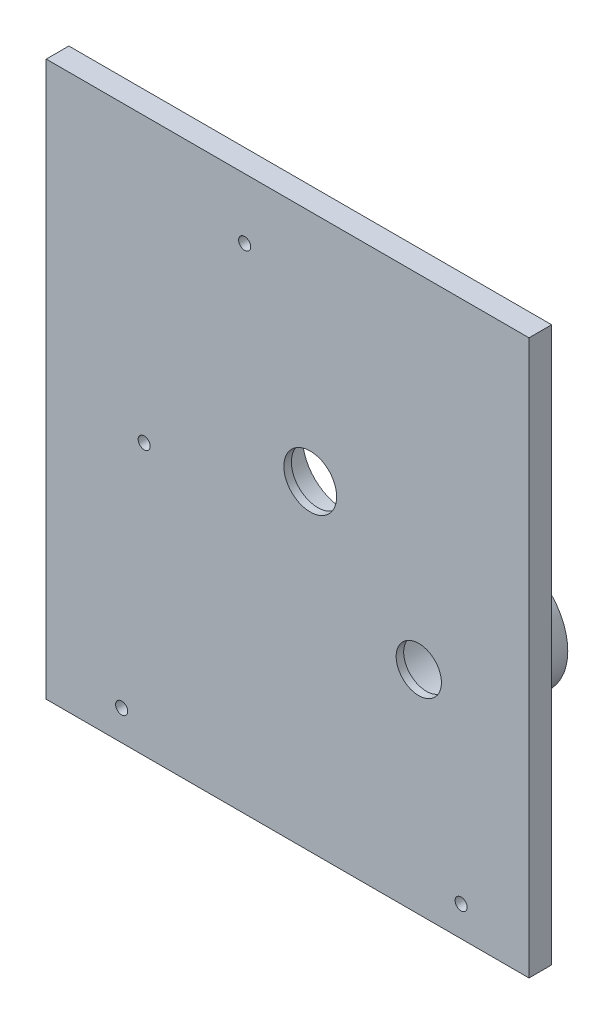
ISO-10303-21;
HEADER;
FILE_DESCRIPTION(('STEP AP214'),'2;1');
FILE_NAME('part.step','',(''),(''),'','','');
FILE_SCHEMA(('AUTOMOTIVE_DESIGN { 1 0 10303 214 1 1 1 1 }'));
ENDSEC;
DATA;
#1=APPLICATION_CONTEXT('core data for automotive mechanical design processes');
#2=APPLICATION_PROTOCOL_DEFINITION('international standard','automotive_design',2000,#1);
#3=PRODUCT_CONTEXT('',#1,'mechanical');
#4=PRODUCT('Part','Part','',(#3));
#5=PRODUCT_RELATED_PRODUCT_CATEGORY('part','',(#4));
#6=PRODUCT_DEFINITION_FORMATION('','',#4);
#7=PRODUCT_DEFINITION_CONTEXT('part definition',#1,'design');
#8=PRODUCT_DEFINITION('design','',#6,#7);
#9=PRODUCT_DEFINITION_SHAPE('','',#8);
#10=(LENGTH_UNIT() NAMED_UNIT(*) SI_UNIT(.MILLI.,.METRE.));
#11=(NAMED_UNIT(*) PLANE_ANGLE_UNIT() SI_UNIT($,.RADIAN.));
#12=(NAMED_UNIT(*) SI_UNIT($,.STERADIAN.) SOLID_ANGLE_UNIT());
#13=UNCERTAINTY_MEASURE_WITH_UNIT(LENGTH_MEASURE(1.E-05),#10,'distance_accuracy_value','');
#14=(GEOMETRIC_REPRESENTATION_CONTEXT(3) GLOBAL_UNCERTAINTY_ASSIGNED_CONTEXT((#13)) GLOBAL_UNIT_ASSIGNED_CONTEXT((#10,
#11,#12)) REPRESENTATION_CONTEXT('',''));
#15=CARTESIAN_POINT('',(0.,0.,0.));
#16=DIRECTION('',(0.,0.,1.));
#17=DIRECTION('',(1.,0.,0.));
#18=AXIS2_PLACEMENT_3D('',#15,#16,#17);
#19=CARTESIAN_POINT('',(28.779245994292,-28.77924599429,-2.));
#20=DIRECTION('',(0.,0.,-1.));
#21=DIRECTION('',(1.,0.,0.));
#22=AXIS2_PLACEMENT_3D('',#19,#20,#21);
#23=CYLINDRICAL_SURFACE('',#22,12.7);
#24=CARTESIAN_POINT('',(37.759502115362,-37.75950211536,-13.7));
#25=CARTESIAN_POINT('',(37.650461904877,-37.86854232584,-13.7));
#26=CARTESIAN_POINT('',(37.541928685919,-37.97404920758,-13.72090495198));
#27=CARTESIAN_POINT('',(37.436312459329,-38.07380946713,-13.76136007281));
#28=CARTESIAN_POINT('',(37.335942627703,-38.16603991759,-13.81944378148));
#29=CARTESIAN_POINT('',(37.242962604331,-38.24940811271,-13.89269380523));
#30=CARTESIAN_POINT('',(37.15915747597,-38.32302706371,-13.97813572432));
#31=CARTESIAN_POINT('',(37.085755111253,-38.38646516662,-14.07231691033));
#32=CARTESIAN_POINT('',(36.965496911283,-38.48908937768,-14.26282459649));
#33=CARTESIAN_POINT('',(36.916053432271,-38.53060100708,-14.36000680346));
#34=CARTESIAN_POINT('',(36.874944151934,-38.56467575526,-14.46151845749));
#35=CARTESIAN_POINT('',(36.842143643054,-38.59160768538,-14.56624065154));
#36=CARTESIAN_POINT('',(36.817600334645,-38.61163420971,-14.67323394699));
#37=CARTESIAN_POINT('',(36.801261306486,-38.62492428934,-14.78168081212));
#38=CARTESIAN_POINT('',(36.793091752401,-38.63156938348,-14.89083952936));
#39=CARTESIAN_POINT('',(36.793091752401,-38.63156938348,-15.13667288948));
#40=CARTESIAN_POINT('',(36.805898042618,-38.62115270491,-15.27338382111));
#41=CARTESIAN_POINT('',(36.831525244994,-38.60030797097,-15.40875066075));
#42=CARTESIAN_POINT('',(36.870075574505,-38.56879582985,-15.54127785331));
#43=CARTESIAN_POINT('',(36.921670105704,-38.52620885157,-15.66922981452));
#44=CARTESIAN_POINT('',(36.986372174624,-38.47200299956,-15.79050613742));
#45=CARTESIAN_POINT('',(37.064086917888,-38.40555634566,-15.90246825689));
#46=CARTESIAN_POINT('',(37.235241327505,-38.25541091671,-16.09041889586));
#47=CARTESIAN_POINT('',(37.328087822277,-38.17257684106,-16.17106842845));
#48=CARTESIAN_POINT('',(37.431150511909,-38.07863871632,-16.2376790855));
#49=CARTESIAN_POINT('',(37.54150431182,-37.97535894599,-16.28581701522));
#50=CARTESIAN_POINT('',(37.655600530426,-37.8652988694,-16.31257087018));
#51=CARTESIAN_POINT('',(37.769763151242,-37.75166648716,-16.31658847496));
#52=CARTESIAN_POINT('',(37.880594793349,-37.63805555986,-16.29813262518));
#53=CARTESIAN_POINT('',(38.151791805837,-37.35268574142,-16.19708559974));
#54=CARTESIAN_POINT('',(38.294364624152,-37.19502166044,-16.08603312995));
#55=CARTESIAN_POINT('',(38.410525668228,-37.06075688414,-15.94042873309));
#56=CARTESIAN_POINT('',(38.501092318106,-36.95271921861,-15.77079385383));
#57=CARTESIAN_POINT('',(38.567244882751,-36.87217027874,-15.58565655945));
#58=CARTESIAN_POINT('',(38.610355376195,-36.8191731119,-15.39186827387));
#59=CARTESIAN_POINT('',(38.631569383486,-36.7930917524,-15.19504226489));
#60=CARTESIAN_POINT('',(38.631569383486,-36.7930917524,-14.8908409672));
#61=CARTESIAN_POINT('',(38.624924468209,-36.80126108556,-14.78168301919));
#62=CARTESIAN_POINT('',(38.611634587314,-36.81759987215,-14.67323593319));
#63=CARTESIAN_POINT('',(38.591608069323,-36.84214317479,-14.56624152804));
#64=CARTESIAN_POINT('',(38.564675804202,-36.87494410242,-14.46151779753));
#65=CARTESIAN_POINT('',(38.530600436905,-36.91605413325,-14.36000494022));
#66=CARTESIAN_POINT('',(38.48908838179,-36.9654980783,-14.26282274775));
#67=CARTESIAN_POINT('',(38.386482332008,-37.08573499632,-14.0723487755));
#68=CARTESIAN_POINT('',(38.323046594774,-37.15913518972,-13.97815678669));
#69=CARTESIAN_POINT('',(38.249414956983,-37.24295565862,-13.89269009212));
#70=CARTESIAN_POINT('',(38.16602412237,-37.33596133853,-13.81942065777));
#71=CARTESIAN_POINT('',(38.073770005835,-37.43635588697,-13.76133272722));
#72=CARTESIAN_POINT('',(37.973996713014,-37.54198353375,-13.7208886858));
#73=CARTESIAN_POINT('',(37.868499899157,-37.65050433156,-13.7));
#74=CARTESIAN_POINT('',(37.759502115362,-37.75950211536,-13.7));
#75=B_SPLINE_CURVE_WITH_KNOTS('',8,(#24,#25,#26,#27,#28,#29,#30,#31,#32,#33,#34,#35,#36,#37,#38,
#39,#40,#41,#42,#43,#44,#45,#46,#47,#48,#49,#50,#51,#52,#53,#54,#55,#56,#57,#58,#59,#60,#61,#62,
#63,#64,#65,#66,#67,#68,#69,#70,#71,#72,#73,#74),.UNSPECIFIED.,.T.,.F.,(9,7,7,7,7,7,7,9),(0.,
0.130152523031,0.250374427446,0.40089663535,0.535566384316,0.750047286717,0.870085514694,1.),.UNSPECIFIED.);
#76=CARTESIAN_POINT('',(37.759502115362,-37.75950211536,-13.7));
#77=VERTEX_POINT('',#76);
#78=EDGE_CURVE('E189',#77,#77,#75,.T.);
#79=ORIENTED_EDGE('',*,*,#78,.T.);
#80=EDGE_LOOP('',(#79));
#81=FACE_BOUND('',#80,.T.);
#82=CARTESIAN_POINT('',(28.779245994292,-28.77924599429,-2.));
#83=DIRECTION('',(0.,0.,-1.));
#84=DIRECTION('',(1.,0.,0.));
#85=AXIS2_PLACEMENT_3D('',#82,#83,#84);
#86=CIRCLE('',#85,12.7);
#87=CARTESIAN_POINT('',(41.479245994292,-28.77924599429,-2.));
#88=VERTEX_POINT('',#87);
#89=EDGE_CURVE('E166',#88,#88,#86,.T.);
#90=ORIENTED_EDGE('',*,*,#89,.F.);
#91=DIRECTION('',(0.,0.,-1.));
#92=VECTOR('',#91,1.);
#93=CARTESIAN_POINT('',(41.479245994292,-28.77924599429,-2.));
#94=LINE('',#93,#92);
#95=CARTESIAN_POINT('',(41.479245994292,-28.77924599429,-24.));
#96=VERTEX_POINT('',#95);
#97=EDGE_CURVE('E9',#88,#96,#94,.T.);
#98=ORIENTED_EDGE('',*,*,#97,.T.);
#99=CARTESIAN_POINT('',(28.779245994292,-28.77924599429,-24.));
#100=DIRECTION('',(0.,0.,-1.));
#101=DIRECTION('',(1.,0.,0.));
#102=AXIS2_PLACEMENT_3D('',#99,#100,#101);
#103=CIRCLE('',#102,12.7);
#104=EDGE_CURVE('E190',#96,#96,#103,.T.);
#105=ORIENTED_EDGE('',*,*,#104,.T.);
#106=ORIENTED_EDGE('',*,*,#97,.F.);
#107=EDGE_LOOP('',(#90,#98,#105,#106));
#108=FACE_BOUND('',#107,.T.);
#109=ADVANCED_FACE('F15',(#81,#108),#23,.F.);
#110=CARTESIAN_POINT('',(0.,0.,-2.));
#111=DIRECTION('',(0.,0.,-1.));
#112=DIRECTION('',(1.,0.,0.));
#113=AXIS2_PLACEMENT_3D('',#110,#111,#112);
#114=CYLINDRICAL_SURFACE('',#113,11.05);
#115=DIRECTION('',(0.,0.,-1.));
#116=VECTOR('',#115,1.);
#117=CARTESIAN_POINT('',(11.05,0.,-2.));
#118=LINE('',#117,#116);
#119=CARTESIAN_POINT('',(11.05,0.,-2.));
#120=VERTEX_POINT('',#119);
#121=CARTESIAN_POINT('',(11.05,0.,-9.));
#122=VERTEX_POINT('',#121);
#123=EDGE_CURVE('E28',#120,#122,#118,.T.);
#124=ORIENTED_EDGE('',*,*,#123,.F.);
#125=CARTESIAN_POINT('',(0.,0.,-2.));
#126=DIRECTION('',(0.,0.,-1.));
#127=DIRECTION('',(1.,0.,0.));
#128=AXIS2_PLACEMENT_3D('',#125,#126,#127);
#129=CIRCLE('',#128,11.05);
#130=EDGE_CURVE('E204',#120,#120,#129,.T.);
#131=ORIENTED_EDGE('',*,*,#130,.F.);
#132=ORIENTED_EDGE('',*,*,#123,.T.);
#133=CARTESIAN_POINT('',(0.,0.,-9.));
#134=DIRECTION('',(0.,0.,-1.));
#135=DIRECTION('',(1.,0.,0.));
#136=AXIS2_PLACEMENT_3D('',#133,#134,#135);
#137=CIRCLE('',#136,11.05);
#138=EDGE_CURVE('E263',#122,#122,#137,.T.);
#139=ORIENTED_EDGE('',*,*,#138,.T.);
#140=EDGE_LOOP('',(#124,#131,#132,#139));
#141=FACE_BOUND('',#140,.T.);
#142=ADVANCED_FACE('F281',(#141),#114,.F.);
#143=CARTESIAN_POINT('',(28.779245994292,-28.77924599429,-2.));
#144=DIRECTION('',(0.,0.,-1.));
#145=DIRECTION('',(0.,-1.,0.));
#146=AXIS2_PLACEMENT_3D('',#143,#144,#145);
#147=PLANE('',#146);
#148=CARTESIAN_POINT('',(28.779245994292,-28.77924599429,-2.));
#149=DIRECTION('',(0.,0.,-1.));
#150=DIRECTION('',(1.,0.,0.));
#151=AXIS2_PLACEMENT_3D('',#148,#149,#150);
#152=CIRCLE('',#151,6.);
#153=CARTESIAN_POINT('',(34.779245994292,-28.77924599429,-2.));
#154=VERTEX_POINT('',#153);
#155=EDGE_CURVE('E251',#154,#154,#152,.T.);
#156=ORIENTED_EDGE('',*,*,#155,.F.);
#157=EDGE_LOOP('',(#156));
#158=FACE_BOUND('',#157,.T.);
#159=ORIENTED_EDGE('',*,*,#89,.T.);
#160=EDGE_LOOP('',(#159));
#161=FACE_BOUND('',#160,.T.);
#162=ADVANCED_FACE('F277',(#158,#161),#147,.T.);
#163=CARTESIAN_POINT('',(0.,0.,-2.));
#164=DIRECTION('',(0.,0.,-1.));
#165=DIRECTION('',(0.,-1.,0.));
#166=AXIS2_PLACEMENT_3D('',#163,#164,#165);
#167=PLANE('',#166);
#168=CARTESIAN_POINT('',(0.,0.,-2.));
#169=DIRECTION('',(0.,0.,-1.));
#170=DIRECTION('',(1.,0.,0.));
#171=AXIS2_PLACEMENT_3D('',#168,#169,#170);
#172=CIRCLE('',#171,7.);
#173=CARTESIAN_POINT('',(7.,0.,-2.));
#174=VERTEX_POINT('',#173);
#175=EDGE_CURVE('E235',#174,#174,#172,.T.);
#176=ORIENTED_EDGE('',*,*,#175,.F.);
#177=EDGE_LOOP('',(#176));
#178=FACE_BOUND('',#177,.T.);
#179=ORIENTED_EDGE('',*,*,#130,.T.);
#180=EDGE_LOOP('',(#179));
#181=FACE_BOUND('',#180,.T.);
#182=ADVANCED_FACE('F280',(#178,#181),#167,.T.);
#183=CARTESIAN_POINT('',(35.143207024971,-35.14320702497,-15.));
#184=DIRECTION('',(0.707106781186548,-0.707106781186548,0.));
#185=DIRECTION('',(0.,0.,1.));
#186=AXIS2_PLACEMENT_3D('',#183,#184,#185);
#187=CYLINDRICAL_SURFACE('',#186,1.3);
#188=DIRECTION('',(0.707106781186548,-0.707106781186548,0.));
#189=VECTOR('',#188,1.);
#190=CARTESIAN_POINT('',(35.143207024971,-35.14320702497,-13.7));
#191=LINE('',#190,#189);
#192=CARTESIAN_POINT('',(39.739401102684,-39.73940110268,-13.7));
#193=VERTEX_POINT('',#192);
#194=EDGE_CURVE('E185',#77,#193,#191,.T.);
#195=ORIENTED_EDGE('',*,*,#194,.F.);
#196=ORIENTED_EDGE('',*,*,#78,.F.);
#197=ORIENTED_EDGE('',*,*,#194,.T.);
#198=CARTESIAN_POINT('',(39.739401102684,-39.73940110268,-13.7));
#199=CARTESIAN_POINT('',(39.625943221093,-39.85285898427,-13.7));
#200=CARTESIAN_POINT('',(39.513457153856,-39.96266042467,-13.72263313503));
#201=CARTESIAN_POINT('',(39.404586714331,-40.06635362367,-13.76628467336));
#202=CARTESIAN_POINT('',(39.301824795817,-40.16196654389,-13.82874292293));
#203=CARTESIAN_POINT('',(39.207409698811,-40.2480201824,-13.9072260165));
#204=CARTESIAN_POINT('',(39.123149894221,-40.32352857562,-13.99841561521));
#205=CARTESIAN_POINT('',(39.050219376437,-40.38802428058,-14.0984989763));
#206=CARTESIAN_POINT('',(38.936809711379,-40.48730750636,-14.29238908591));
#207=CARTESIAN_POINT('',(38.892227658128,-40.52586540643,-14.38644473771));
#208=CARTESIAN_POINT('',(38.855200591353,-40.55758553642,-14.48423376382));
#209=CARTESIAN_POINT('',(38.825677175152,-40.58269991262,-14.58480059896));
#210=CARTESIAN_POINT('',(38.80359432467,-40.60139768473,-14.68733850356));
#211=CARTESIAN_POINT('',(38.788895330839,-40.61381461563,-14.79114345518));
#212=CARTESIAN_POINT('',(38.781545531931,-40.62002316301,-14.89557156225));
#213=CARTESIAN_POINT('',(38.781545531931,-40.62002316301,-15.13662814283));
#214=CARTESIAN_POINT('',(38.794126038121,-40.60939591523,-15.27329765444));
#215=CARTESIAN_POINT('',(38.81930248709,-40.58812882513,-15.40863499432));
#216=CARTESIAN_POINT('',(38.857194373328,-40.55599154932,-15.54115096834));
#217=CARTESIAN_POINT('',(38.907956225339,-40.51259771868,-15.66911276496));
#218=CARTESIAN_POINT('',(38.971703206897,-40.45744115554,-15.79041847662));
#219=CARTESIAN_POINT('',(39.048412586111,-40.38995873762,-15.90242337583));
#220=CARTESIAN_POINT('',(39.217714734278,-40.2378635383,-16.09043105456));
#221=CARTESIAN_POINT('',(39.309658118117,-40.15411982757,-16.17107831196));
#222=CARTESIAN_POINT('',(39.411895557439,-40.05935649378,-16.23768580474));
#223=CARTESIAN_POINT('',(39.521611002259,-39.95543727781,-16.28582218233));
#224=CARTESIAN_POINT('',(39.635344179846,-39.84501148071,-16.31257366086));
#225=CARTESIAN_POINT('',(39.749458000337,-39.73133132282,-16.31658713835));
#226=CARTESIAN_POINT('',(39.860535344799,-39.61797627224,-16.29812902331));
#227=CARTESIAN_POINT('',(40.133067278953,-39.33383070942,-16.197061906));
#228=CARTESIAN_POINT('',(40.277041492998,-39.17748769457,-16.08595168759));
#229=CARTESIAN_POINT('',(40.394848720578,-39.0448488947,-15.94028268267));
#230=CARTESIAN_POINT('',(40.486985233856,-38.93841310303,-15.77059836585));
#231=CARTESIAN_POINT('',(40.554416232005,-38.85920914176,-15.58544333492));
#232=CARTESIAN_POINT('',(40.598391708589,-38.80715343228,-15.39168024994));
#233=CARTESIAN_POINT('',(40.620023163016,-38.78154553193,-15.19492671048));
#234=CARTESIAN_POINT('',(40.620023163016,-38.78154553193,-14.89557259311));
#235=CARTESIAN_POINT('',(40.613814733481,-38.78889520252,-14.79114506668));
#236=CARTESIAN_POINT('',(40.601397947834,-38.80359401161,-14.68733993968));
#237=CARTESIAN_POINT('',(40.582700187262,-38.8256768436,-14.58480115804));
#238=CARTESIAN_POINT('',(40.557585546986,-38.8552005849,-14.4842331007));
#239=CARTESIAN_POINT('',(40.525864904427,-38.89222825601,-14.38644309083));
#240=CARTESIAN_POINT('',(40.487306649276,-38.93681069041,-14.29238741212));
#241=CARTESIAN_POINT('',(40.388043105908,-39.05019787256,-14.09853574027));
#242=CARTESIAN_POINT('',(40.323550514466,-39.12312535319,-13.99844027524));
#243=CARTESIAN_POINT('',(40.248028348729,-39.20740134178,-13.90722221459));
#244=CARTESIAN_POINT('',(40.161949444393,-39.30184457998,-13.82871653783));
#245=CARTESIAN_POINT('',(40.066309842044,-39.40463424572,-13.76625311167));
#246=CARTESIAN_POINT('',(39.962601828139,-39.51351799373,-13.72261421457));
#247=CARTESIAN_POINT('',(39.852811543501,-39.62599066186,-13.7));
#248=CARTESIAN_POINT('',(39.739401102684,-39.73940110268,-13.7));
#249=B_SPLINE_CURVE_WITH_KNOTS('',8,(#198,#199,#200,#201,#202,#203,#204,#205,#206,#207,#208,
#209,#210,#211,#212,#213,#214,#215,#216,#217,#218,#219,#220,#221,#222,#223,#224,#225,#226,#227,
#228,#229,#230,#231,#232,#233,#234,#235,#236,#237,#238,#239,#240,#241,#242,#243,#244,#245,#246,
#247,#248),.UNSPECIFIED.,.T.,.F.,(9,7,7,7,7,7,7,9),(0.,0.135160186932,0.250245984695,
0.400817602485,0.535489082991,0.750074444956,0.865033512641,1.),.UNSPECIFIED.);
#250=EDGE_CURVE('E19',#193,#193,#249,.T.);
#251=ORIENTED_EDGE('',*,*,#250,.T.);
#252=EDGE_LOOP('',(#195,#196,#197,#251));
#253=FACE_BOUND('',#252,.T.);
#254=ADVANCED_FACE('F427',(#253),#187,.F.);
#255=CARTESIAN_POINT('',(28.779245994292,-28.77924599429,-24.));
#256=DIRECTION('',(0.,0.,-1.));
#257=DIRECTION('',(0.,-1.,0.));
#258=AXIS2_PLACEMENT_3D('',#255,#256,#257);
#259=PLANE('',#258);
#260=ORIENTED_EDGE('',*,*,#104,.F.);
#261=EDGE_LOOP('',(#260));
#262=FACE_BOUND('',#261,.T.);
#263=CARTESIAN_POINT('',(28.779245994292,-28.77924599429,-24.));
#264=DIRECTION('',(0.,0.,-1.));
#265=DIRECTION('',(1.,0.,0.));
#266=AXIS2_PLACEMENT_3D('',#263,#264,#265);
#267=CIRCLE('',#266,15.5);
#268=CARTESIAN_POINT('',(44.279245994292,-28.77924599429,-24.));
#269=VERTEX_POINT('',#268);
#270=EDGE_CURVE('E330',#269,#269,#267,.T.);
#271=ORIENTED_EDGE('',*,*,#270,.T.);
#272=EDGE_LOOP('',(#271));
#273=FACE_BOUND('',#272,.T.);
#274=ADVANCED_FACE('F485',(#262,#273),#259,.T.);
#275=CARTESIAN_POINT('',(0.,0.,-9.));
#276=DIRECTION('',(0.,0.,-1.));
#277=DIRECTION('',(0.,-1.,0.));
#278=AXIS2_PLACEMENT_3D('',#275,#276,#277);
#279=PLANE('',#278);
#280=ORIENTED_EDGE('',*,*,#138,.F.);
#281=EDGE_LOOP('',(#280));
#282=FACE_BOUND('',#281,.T.);
#283=CARTESIAN_POINT('',(0.,0.,-9.));
#284=DIRECTION('',(0.,0.,-1.));
#285=DIRECTION('',(1.,0.,0.));
#286=AXIS2_PLACEMENT_3D('',#283,#284,#285);
#287=CIRCLE('',#286,15.);
#288=CARTESIAN_POINT('',(15.,0.,-9.));
#289=VERTEX_POINT('',#288);
#290=EDGE_CURVE('E162',#289,#289,#287,.T.);
#291=ORIENTED_EDGE('',*,*,#290,.T.);
#292=EDGE_LOOP('',(#291));
#293=FACE_BOUND('',#292,.T.);
#294=ADVANCED_FACE('F398',(#282,#293),#279,.T.);
#295=CARTESIAN_POINT('',(28.779245994292,-28.77924599429,5.));
#296=DIRECTION('',(0.,0.,-1.));
#297=DIRECTION('',(1.,0.,0.));
#298=AXIS2_PLACEMENT_3D('',#295,#296,#297);
#299=CYLINDRICAL_SURFACE('',#298,6.);
#300=DIRECTION('',(0.,0.,-1.));
#301=VECTOR('',#300,1.);
#302=CARTESIAN_POINT('',(34.779245994292,-28.77924599429,5.));
#303=LINE('',#302,#301);
#304=CARTESIAN_POINT('',(34.779245994292,-28.77924599429,0.));
#305=VERTEX_POINT('',#304);
#306=EDGE_CURVE('E241',#305,#154,#303,.T.);
#307=ORIENTED_EDGE('',*,*,#306,.F.);
#308=CARTESIAN_POINT('',(28.779245994292,-28.77924599429,0.));
#309=DIRECTION('',(0.,0.,-1.));
#310=DIRECTION('',(1.,0.,0.));
#311=AXIS2_PLACEMENT_3D('',#308,#309,#310);
#312=CIRCLE('',#311,6.);
#313=EDGE_CURVE('E184',#305,#305,#312,.T.);
#314=ORIENTED_EDGE('',*,*,#313,.F.);
#315=ORIENTED_EDGE('',*,*,#306,.T.);
#316=ORIENTED_EDGE('',*,*,#155,.T.);
#317=EDGE_LOOP('',(#307,#314,#315,#316));
#318=FACE_BOUND('',#317,.T.);
#319=ADVANCED_FACE('F274',(#318),#299,.F.);
#320=CARTESIAN_POINT('',(0.,0.,5.));
#321=DIRECTION('',(0.,0.,-1.));
#322=DIRECTION('',(1.,0.,0.));
#323=AXIS2_PLACEMENT_3D('',#320,#321,#322);
#324=CYLINDRICAL_SURFACE('',#323,7.);
#325=DIRECTION('',(0.,0.,-1.));
#326=VECTOR('',#325,1.);
#327=CARTESIAN_POINT('',(7.,0.,5.));
#328=LINE('',#327,#326);
#329=CARTESIAN_POINT('',(7.,0.,0.));
#330=VERTEX_POINT('',#329);
#331=EDGE_CURVE('E231',#330,#174,#328,.T.);
#332=ORIENTED_EDGE('',*,*,#331,.F.);
#333=CARTESIAN_POINT('',(0.,0.,0.));
#334=DIRECTION('',(0.,0.,-1.));
#335=DIRECTION('',(1.,0.,0.));
#336=AXIS2_PLACEMENT_3D('',#333,#334,#335);
#337=CIRCLE('',#336,7.);
#338=EDGE_CURVE('E179',#330,#330,#337,.T.);
#339=ORIENTED_EDGE('',*,*,#338,.F.);
#340=ORIENTED_EDGE('',*,*,#331,.T.);
#341=ORIENTED_EDGE('',*,*,#175,.T.);
#342=EDGE_LOOP('',(#332,#339,#340,#341));
#343=FACE_BOUND('',#342,.T.);
#344=ADVANCED_FACE('F397',(#343),#324,.F.);
#345=CARTESIAN_POINT('',(40.,-77.,20.));
#346=DIRECTION('',(0.,0.,-1.));
#347=DIRECTION('',(1.,0.,0.));
#348=AXIS2_PLACEMENT_3D('',#345,#346,#347);
#349=CYLINDRICAL_SURFACE('',#348,1.6);
#350=DIRECTION('',(0.,0.,-1.));
#351=VECTOR('',#350,1.);
#352=CARTESIAN_POINT('',(41.6,-77.,20.));
#353=LINE('',#352,#351);
#354=CARTESIAN_POINT('',(41.6,-77.,0.));
#355=VERTEX_POINT('',#354);
#356=CARTESIAN_POINT('',(41.6,-77.,-6.));
#357=VERTEX_POINT('',#356);
#358=EDGE_CURVE('E228',#355,#357,#353,.T.);
#359=ORIENTED_EDGE('',*,*,#358,.F.);
#360=CARTESIAN_POINT('',(40.,-77.,0.));
#361=DIRECTION('',(0.,0.,-1.));
#362=DIRECTION('',(1.,0.,0.));
#363=AXIS2_PLACEMENT_3D('',#360,#361,#362);
#364=CIRCLE('',#363,1.6);
#365=EDGE_CURVE('E262',#355,#355,#364,.T.);
#366=ORIENTED_EDGE('',*,*,#365,.F.);
#367=ORIENTED_EDGE('',*,*,#358,.T.);
#368=CARTESIAN_POINT('',(40.,-77.,-6.));
#369=DIRECTION('',(0.,0.,-1.));
#370=DIRECTION('',(1.,0.,0.));
#371=AXIS2_PLACEMENT_3D('',#368,#369,#370);
#372=CIRCLE('',#371,1.6);
#373=EDGE_CURVE('E145',#357,#357,#372,.T.);
#374=ORIENTED_EDGE('',*,*,#373,.T.);
#375=EDGE_LOOP('',(#359,#366,#367,#374));
#376=FACE_BOUND('',#375,.T.);
#377=ADVANCED_FACE('F17',(#376),#349,.F.);
#378=CARTESIAN_POINT('',(28.779245994292,-28.77924599429,-6.));
#379=DIRECTION('',(0.,0.,-1.));
#380=DIRECTION('',(1.,0.,0.));
#381=AXIS2_PLACEMENT_3D('',#378,#379,#380);
#382=CYLINDRICAL_SURFACE('',#381,15.5);
#383=ORIENTED_EDGE('',*,*,#250,.F.);
#384=EDGE_LOOP('',(#383));
#385=FACE_BOUND('',#384,.T.);
#386=DIRECTION('',(0.,0.,-1.));
#387=VECTOR('',#386,1.);
#388=CARTESIAN_POINT('',(44.279245994292,-28.77924599429,-6.));
#389=LINE('',#388,#387);
#390=CARTESIAN_POINT('',(44.279245994292,-28.77924599429,-6.));
#391=VERTEX_POINT('',#390);
#392=EDGE_CURVE('E174',#391,#269,#389,.T.);
#393=ORIENTED_EDGE('',*,*,#392,.T.);
#394=ORIENTED_EDGE('',*,*,#270,.F.);
#395=ORIENTED_EDGE('',*,*,#392,.F.);
#396=CARTESIAN_POINT('',(28.779245994292,-28.77924599429,-6.));
#397=DIRECTION('',(0.,0.,-1.));
#398=DIRECTION('',(1.,0.,0.));
#399=AXIS2_PLACEMENT_3D('',#396,#397,#398);
#400=CIRCLE('',#399,15.5);
#401=EDGE_CURVE('E152',#391,#391,#400,.T.);
#402=ORIENTED_EDGE('',*,*,#401,.T.);
#403=EDGE_LOOP('',(#393,#394,#395,#402));
#404=FACE_BOUND('',#403,.T.);
#405=ADVANCED_FACE('F400',(#385,#404),#382,.T.);
#406=CARTESIAN_POINT('',(-50.,-77.,20.));
#407=DIRECTION('',(0.,0.,-1.));
#408=DIRECTION('',(1.,0.,0.));
#409=AXIS2_PLACEMENT_3D('',#406,#407,#408);
#410=CYLINDRICAL_SURFACE('',#409,1.6);
#411=DIRECTION('',(0.,0.,-1.));
#412=VECTOR('',#411,1.);
#413=CARTESIAN_POINT('',(-48.4,-77.,20.));
#414=LINE('',#413,#412);
#415=CARTESIAN_POINT('',(-48.4,-77.,0.));
#416=VERTEX_POINT('',#415);
#417=CARTESIAN_POINT('',(-48.4,-77.,-6.));
#418=VERTEX_POINT('',#417);
#419=EDGE_CURVE('E161',#416,#418,#414,.T.);
#420=ORIENTED_EDGE('',*,*,#419,.F.);
#421=CARTESIAN_POINT('',(-50.,-77.,0.));
#422=DIRECTION('',(0.,0.,-1.));
#423=DIRECTION('',(1.,0.,0.));
#424=AXIS2_PLACEMENT_3D('',#421,#422,#423);
#425=CIRCLE('',#424,1.6);
#426=EDGE_CURVE('E180',#416,#416,#425,.T.);
#427=ORIENTED_EDGE('',*,*,#426,.F.);
#428=ORIENTED_EDGE('',*,*,#419,.T.);
#429=CARTESIAN_POINT('',(-50.,-77.,-6.));
#430=DIRECTION('',(0.,0.,-1.));
#431=DIRECTION('',(1.,0.,0.));
#432=AXIS2_PLACEMENT_3D('',#429,#430,#431);
#433=CIRCLE('',#432,1.6);
#434=EDGE_CURVE('E195',#418,#418,#433,.T.);
#435=ORIENTED_EDGE('',*,*,#434,.T.);
#436=EDGE_LOOP('',(#420,#427,#428,#435));
#437=FACE_BOUND('',#436,.T.);
#438=ADVANCED_FACE('F393',(#437),#410,.F.);
#439=CARTESIAN_POINT('',(0.,0.,-6.));
#440=DIRECTION('',(0.,0.,-1.));
#441=DIRECTION('',(1.,0.,0.));
#442=AXIS2_PLACEMENT_3D('',#439,#440,#441);
#443=CYLINDRICAL_SURFACE('',#442,15.);
#444=ORIENTED_EDGE('',*,*,#290,.F.);
#445=DIRECTION('',(0.,0.,-1.));
#446=VECTOR('',#445,1.);
#447=CARTESIAN_POINT('',(15.,0.,-6.));
#448=LINE('',#447,#446);
#449=CARTESIAN_POINT('',(15.,0.,-6.));
#450=VERTEX_POINT('',#449);
#451=EDGE_CURVE('E158',#450,#289,#448,.T.);
#452=ORIENTED_EDGE('',*,*,#451,.F.);
#453=CARTESIAN_POINT('',(0.,0.,-6.));
#454=DIRECTION('',(0.,0.,-1.));
#455=DIRECTION('',(1.,0.,0.));
#456=AXIS2_PLACEMENT_3D('',#453,#454,#455);
#457=CIRCLE('',#456,15.);
#458=EDGE_CURVE('E191',#450,#450,#457,.T.);
#459=ORIENTED_EDGE('',*,*,#458,.T.);
#460=ORIENTED_EDGE('',*,*,#451,.T.);
#461=EDGE_LOOP('',(#444,#452,#459,#460));
#462=FACE_BOUND('',#461,.T.);
#463=ADVANCED_FACE('F390',(#462),#443,.T.);
#464=CARTESIAN_POINT('',(-44.02985074626,-13.1343283582,20.));
#465=DIRECTION('',(0.,0.,-1.));
#466=DIRECTION('',(1.,0.,0.));
#467=AXIS2_PLACEMENT_3D('',#464,#465,#466);
#468=CYLINDRICAL_SURFACE('',#467,1.6);
#469=DIRECTION('',(0.,0.,-1.));
#470=VECTOR('',#469,1.);
#471=CARTESIAN_POINT('',(-42.42985074626,-13.1343283582,20.));
#472=LINE('',#471,#470);
#473=CARTESIAN_POINT('',(-42.42985074626,-13.1343283582,0.));
#474=VERTEX_POINT('',#473);
#475=CARTESIAN_POINT('',(-42.42985074626,-13.1343283582,-6.));
#476=VERTEX_POINT('',#475);
#477=EDGE_CURVE('E257',#474,#476,#472,.T.);
#478=ORIENTED_EDGE('',*,*,#477,.F.);
#479=CARTESIAN_POINT('',(-44.02985074626,-13.1343283582,0.));
#480=DIRECTION('',(0.,0.,-1.));
#481=DIRECTION('',(1.,0.,0.));
#482=AXIS2_PLACEMENT_3D('',#479,#480,#481);
#483=CIRCLE('',#482,1.6);
#484=EDGE_CURVE('E175',#474,#474,#483,.T.);
#485=ORIENTED_EDGE('',*,*,#484,.F.);
#486=ORIENTED_EDGE('',*,*,#477,.T.);
#487=CARTESIAN_POINT('',(-44.02985074626,-13.1343283582,-6.));
#488=DIRECTION('',(0.,0.,-1.));
#489=DIRECTION('',(1.,0.,0.));
#490=AXIS2_PLACEMENT_3D('',#487,#488,#489);
#491=CIRCLE('',#490,1.6);
#492=EDGE_CURVE('E196',#476,#476,#491,.T.);
#493=ORIENTED_EDGE('',*,*,#492,.T.);
#494=EDGE_LOOP('',(#478,#485,#486,#493));
#495=FACE_BOUND('',#494,.T.);
#496=ADVANCED_FACE('F311',(#495),#468,.F.);
#497=CARTESIAN_POINT('',(-17.38805970149,45.970149253731,20.));
#498=DIRECTION('',(0.,0.,-1.));
#499=DIRECTION('',(1.,0.,0.));
#500=AXIS2_PLACEMENT_3D('',#497,#498,#499);
#501=CYLINDRICAL_SURFACE('',#500,1.6);
#502=DIRECTION('',(0.,0.,-1.));
#503=VECTOR('',#502,1.);
#504=CARTESIAN_POINT('',(-15.78805970149,45.970149253731,20.));
#505=LINE('',#504,#503);
#506=CARTESIAN_POINT('',(-15.78805970149,45.970149253731,0.));
#507=VERTEX_POINT('',#506);
#508=CARTESIAN_POINT('',(-15.78805970149,45.970149253731,-6.));
#509=VERTEX_POINT('',#508);
#510=EDGE_CURVE('E313',#507,#509,#505,.T.);
#511=ORIENTED_EDGE('',*,*,#510,.F.);
#512=CARTESIAN_POINT('',(-17.38805970149,45.970149253731,0.));
#513=DIRECTION('',(0.,0.,-1.));
#514=DIRECTION('',(1.,0.,0.));
#515=AXIS2_PLACEMENT_3D('',#512,#513,#514);
#516=CIRCLE('',#515,1.6);
#517=EDGE_CURVE('E129',#507,#507,#516,.T.);
#518=ORIENTED_EDGE('',*,*,#517,.F.);
#519=ORIENTED_EDGE('',*,*,#510,.T.);
#520=CARTESIAN_POINT('',(-17.38805970149,45.970149253731,-6.));
#521=DIRECTION('',(0.,0.,-1.));
#522=DIRECTION('',(1.,0.,0.));
#523=AXIS2_PLACEMENT_3D('',#520,#521,#522);
#524=CIRCLE('',#523,1.6);
#525=EDGE_CURVE('E198',#509,#509,#524,.T.);
#526=ORIENTED_EDGE('',*,*,#525,.T.);
#527=EDGE_LOOP('',(#511,#518,#519,#526));
#528=FACE_BOUND('',#527,.T.);
#529=ADVANCED_FACE('F512',(#528),#501,.F.);
#530=CARTESIAN_POINT('',(58.,62.,0.));
#531=DIRECTION('',(1.,0.,0.));
#532=DIRECTION('',(0.,1.,0.));
#533=AXIS2_PLACEMENT_3D('',#530,#531,#532);
#534=PLANE('',#533);
#535=DIRECTION('',(0.,0.,-1.));
#536=VECTOR('',#535,1.);
#537=CARTESIAN_POINT('',(58.,62.,0.));
#538=LINE('',#537,#536);
#539=CARTESIAN_POINT('',(58.,62.,0.));
#540=VERTEX_POINT('',#539);
#541=CARTESIAN_POINT('',(58.,62.,-6.));
#542=VERTEX_POINT('',#541);
#543=EDGE_CURVE('E123',#540,#542,#538,.T.);
#544=ORIENTED_EDGE('',*,*,#543,.F.);
#545=DIRECTION('',(0.,-1.,0.));
#546=VECTOR('',#545,1.);
#547=CARTESIAN_POINT('',(58.,62.,0.));
#548=LINE('',#547,#546);
#549=CARTESIAN_POINT('',(58.,-85.,0.));
#550=VERTEX_POINT('',#549);
#551=EDGE_CURVE('E117',#540,#550,#548,.T.);
#552=ORIENTED_EDGE('',*,*,#551,.T.);
#553=DIRECTION('',(0.,0.,-1.));
#554=VECTOR('',#553,1.);
#555=CARTESIAN_POINT('',(58.,-85.,0.));
#556=LINE('',#555,#554);
#557=CARTESIAN_POINT('',(58.,-85.,-6.));
#558=VERTEX_POINT('',#557);
#559=EDGE_CURVE('E120',#550,#558,#556,.T.);
#560=ORIENTED_EDGE('',*,*,#559,.T.);
#561=DIRECTION('',(0.,-1.,0.));
#562=VECTOR('',#561,1.);
#563=CARTESIAN_POINT('',(58.,62.,-6.));
#564=LINE('',#563,#562);
#565=EDGE_CURVE('E199',#542,#558,#564,.T.);
#566=ORIENTED_EDGE('',*,*,#565,.F.);
#567=EDGE_LOOP('',(#544,#552,#560,#566));
#568=FACE_BOUND('',#567,.T.);
#569=ADVANCED_FACE('F119',(#568),#534,.T.);
#570=CARTESIAN_POINT('',(-70.,62.,0.));
#571=DIRECTION('',(0.,0.,-1.));
#572=DIRECTION('',(0.,-1.,0.));
#573=AXIS2_PLACEMENT_3D('',#570,#571,#572);
#574=PLANE('',#573);
#575=ORIENTED_EDGE('',*,*,#365,.T.);
#576=EDGE_LOOP('',(#575));
#577=FACE_BOUND('',#576,.T.);
#578=ORIENTED_EDGE('',*,*,#313,.T.);
#579=EDGE_LOOP('',(#578));
#580=FACE_BOUND('',#579,.T.);
#581=ORIENTED_EDGE('',*,*,#426,.T.);
#582=EDGE_LOOP('',(#581));
#583=FACE_BOUND('',#582,.T.);
#584=ORIENTED_EDGE('',*,*,#338,.T.);
#585=EDGE_LOOP('',(#584));
#586=FACE_BOUND('',#585,.T.);
#587=ORIENTED_EDGE('',*,*,#484,.T.);
#588=EDGE_LOOP('',(#587));
#589=FACE_BOUND('',#588,.T.);
#590=ORIENTED_EDGE('',*,*,#517,.T.);
#591=EDGE_LOOP('',(#590));
#592=FACE_BOUND('',#591,.T.);
#593=DIRECTION('',(1.,0.,0.));
#594=VECTOR('',#593,1.);
#595=CARTESIAN_POINT('',(-70.,-85.,0.));
#596=LINE('',#595,#594);
#597=CARTESIAN_POINT('',(-70.,-85.,0.));
#598=VERTEX_POINT('',#597);
#599=EDGE_CURVE('E134',#598,#550,#596,.T.);
#600=ORIENTED_EDGE('',*,*,#599,.T.);
#601=ORIENTED_EDGE('',*,*,#551,.F.);
#602=DIRECTION('',(1.,0.,0.));
#603=VECTOR('',#602,1.);
#604=CARTESIAN_POINT('',(-70.,62.,0.));
#605=LINE('',#604,#603);
#606=CARTESIAN_POINT('',(-70.,62.,0.));
#607=VERTEX_POINT('',#606);
#608=EDGE_CURVE('E244',#607,#540,#605,.T.);
#609=ORIENTED_EDGE('',*,*,#608,.F.);
#610=DIRECTION('',(0.,-1.,0.));
#611=VECTOR('',#610,1.);
#612=CARTESIAN_POINT('',(-70.,62.,0.));
#613=LINE('',#612,#611);
#614=EDGE_CURVE('E142',#607,#598,#613,.T.);
#615=ORIENTED_EDGE('',*,*,#614,.T.);
#616=EDGE_LOOP('',(#600,#601,#609,#615));
#617=FACE_BOUND('',#616,.T.);
#618=ADVANCED_FACE('F140',(#577,#580,#583,#586,#589,#592,#617),#574,.F.);
#619=CARTESIAN_POINT('',(-70.,-85.,0.));
#620=DIRECTION('',(0.,-1.,0.));
#621=DIRECTION('',(-1.,0.,0.));
#622=AXIS2_PLACEMENT_3D('',#619,#620,#621);
#623=PLANE('',#622);
#624=ORIENTED_EDGE('',*,*,#599,.F.);
#625=DIRECTION('',(0.,0.,-1.));
#626=VECTOR('',#625,1.);
#627=CARTESIAN_POINT('',(-70.,-85.,0.));
#628=LINE('',#627,#626);
#629=CARTESIAN_POINT('',(-70.,-85.,-6.));
#630=VERTEX_POINT('',#629);
#631=EDGE_CURVE('E167',#598,#630,#628,.T.);
#632=ORIENTED_EDGE('',*,*,#631,.T.);
#633=DIRECTION('',(1.,0.,0.));
#634=VECTOR('',#633,1.);
#635=CARTESIAN_POINT('',(-70.,-85.,-6.));
#636=LINE('',#635,#634);
#637=EDGE_CURVE('E136',#630,#558,#636,.T.);
#638=ORIENTED_EDGE('',*,*,#637,.T.);
#639=ORIENTED_EDGE('',*,*,#559,.F.);
#640=EDGE_LOOP('',(#624,#632,#638,#639));
#641=FACE_BOUND('',#640,.T.);
#642=ADVANCED_FACE('F132',(#641),#623,.T.);
#643=CARTESIAN_POINT('',(-70.,62.,-6.));
#644=DIRECTION('',(0.,0.,-1.));
#645=DIRECTION('',(0.,-1.,0.));
#646=AXIS2_PLACEMENT_3D('',#643,#644,#645);
#647=PLANE('',#646);
#648=ORIENTED_EDGE('',*,*,#373,.F.);
#649=EDGE_LOOP('',(#648));
#650=FACE_BOUND('',#649,.T.);
#651=ORIENTED_EDGE('',*,*,#401,.F.);
#652=EDGE_LOOP('',(#651));
#653=FACE_BOUND('',#652,.T.);
#654=ORIENTED_EDGE('',*,*,#434,.F.);
#655=EDGE_LOOP('',(#654));
#656=FACE_BOUND('',#655,.T.);
#657=ORIENTED_EDGE('',*,*,#458,.F.);
#658=EDGE_LOOP('',(#657));
#659=FACE_BOUND('',#658,.T.);
#660=ORIENTED_EDGE('',*,*,#492,.F.);
#661=EDGE_LOOP('',(#660));
#662=FACE_BOUND('',#661,.T.);
#663=ORIENTED_EDGE('',*,*,#525,.F.);
#664=EDGE_LOOP('',(#663));
#665=FACE_BOUND('',#664,.T.);
#666=DIRECTION('',(0.,-1.,0.));
#667=VECTOR('',#666,1.);
#668=CARTESIAN_POINT('',(-70.,62.,-6.));
#669=LINE('',#668,#667);
#670=CARTESIAN_POINT('',(-70.,62.,-6.));
#671=VERTEX_POINT('',#670);
#672=EDGE_CURVE('E170',#671,#630,#669,.T.);
#673=ORIENTED_EDGE('',*,*,#672,.F.);
#674=DIRECTION('',(1.,0.,0.));
#675=VECTOR('',#674,1.);
#676=CARTESIAN_POINT('',(-70.,62.,-6.));
#677=LINE('',#676,#675);
#678=EDGE_CURVE('E226',#671,#542,#677,.T.);
#679=ORIENTED_EDGE('',*,*,#678,.T.);
#680=ORIENTED_EDGE('',*,*,#565,.T.);
#681=ORIENTED_EDGE('',*,*,#637,.F.);
#682=EDGE_LOOP('',(#673,#679,#680,#681));
#683=FACE_BOUND('',#682,.T.);
#684=ADVANCED_FACE('F349',(#650,#653,#656,#659,#662,#665,#683),#647,.T.);
#685=CARTESIAN_POINT('',(-70.,62.,0.));
#686=DIRECTION('',(0.,-1.,0.));
#687=DIRECTION('',(-1.,0.,0.));
#688=AXIS2_PLACEMENT_3D('',#685,#686,#687);
#689=PLANE('',#688);
#690=ORIENTED_EDGE('',*,*,#543,.T.);
#691=ORIENTED_EDGE('',*,*,#678,.F.);
#692=DIRECTION('',(0.,0.,-1.));
#693=VECTOR('',#692,1.);
#694=CARTESIAN_POINT('',(-70.,62.,0.));
#695=LINE('',#694,#693);
#696=EDGE_CURVE('E156',#607,#671,#695,.T.);
#697=ORIENTED_EDGE('',*,*,#696,.F.);
#698=ORIENTED_EDGE('',*,*,#608,.T.);
#699=EDGE_LOOP('',(#690,#691,#697,#698));
#700=FACE_BOUND('',#699,.T.);
#701=ADVANCED_FACE('F352',(#700),#689,.F.);
#702=CARTESIAN_POINT('',(-70.,62.,0.));
#703=DIRECTION('',(1.,0.,0.));
#704=DIRECTION('',(0.,1.,0.));
#705=AXIS2_PLACEMENT_3D('',#702,#703,#704);
#706=PLANE('',#705);
#707=ORIENTED_EDGE('',*,*,#672,.T.);
#708=ORIENTED_EDGE('',*,*,#631,.F.);
#709=ORIENTED_EDGE('',*,*,#614,.F.);
#710=ORIENTED_EDGE('',*,*,#696,.T.);
#711=EDGE_LOOP('',(#707,#708,#709,#710));
#712=FACE_BOUND('',#711,.T.);
#713=ADVANCED_FACE('F367',(#712),#706,.F.);
#714=CLOSED_SHELL('',(#109,#142,#162,#182,#254,#274,#294,#319,#344,#377,#405,#438,#463,#496,
#529,#569,#618,#642,#684,#701,#713));
#715=MANIFOLD_SOLID_BREP('B1',#714);
#716=ADVANCED_BREP_SHAPE_REPRESENTATION('',(#18,#715),#14);
#717=SHAPE_DEFINITION_REPRESENTATION(#9,#716);
ENDSEC;
END-ISO-10303-21;
